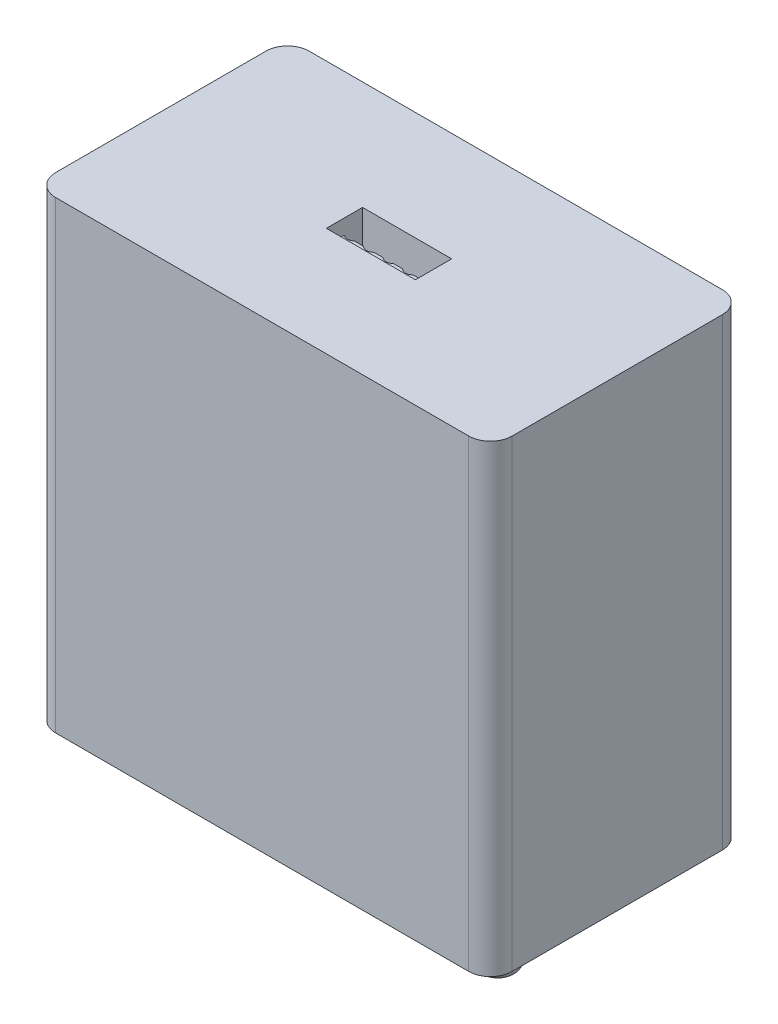
ISO-10303-21;
HEADER;
FILE_DESCRIPTION(('STEP AP214'),'2;1');
FILE_NAME('part.step','',(''),(''),'','','');
FILE_SCHEMA(('AUTOMOTIVE_DESIGN { 1 0 10303 214 1 1 1 1 }'));
ENDSEC;
DATA;
#1=APPLICATION_CONTEXT('core data for automotive mechanical design processes');
#2=APPLICATION_PROTOCOL_DEFINITION('international standard','automotive_design',2000,#1);
#3=PRODUCT_CONTEXT('',#1,'mechanical');
#4=PRODUCT('Part','Part','',(#3));
#5=PRODUCT_RELATED_PRODUCT_CATEGORY('part','',(#4));
#6=PRODUCT_DEFINITION_FORMATION('','',#4);
#7=PRODUCT_DEFINITION_CONTEXT('part definition',#1,'design');
#8=PRODUCT_DEFINITION('design','',#6,#7);
#9=PRODUCT_DEFINITION_SHAPE('','',#8);
#10=(LENGTH_UNIT() NAMED_UNIT(*) SI_UNIT(.MILLI.,.METRE.));
#11=(NAMED_UNIT(*) PLANE_ANGLE_UNIT() SI_UNIT($,.RADIAN.));
#12=(NAMED_UNIT(*) SI_UNIT($,.STERADIAN.) SOLID_ANGLE_UNIT());
#13=UNCERTAINTY_MEASURE_WITH_UNIT(LENGTH_MEASURE(1.E-05),#10,'distance_accuracy_value','');
#14=(GEOMETRIC_REPRESENTATION_CONTEXT(3) GLOBAL_UNCERTAINTY_ASSIGNED_CONTEXT((#13)) GLOBAL_UNIT_ASSIGNED_CONTEXT((#10,
#11,#12)) REPRESENTATION_CONTEXT('',''));
#15=CARTESIAN_POINT('',(0.,0.,0.));
#16=DIRECTION('',(0.,0.,1.));
#17=DIRECTION('',(1.,0.,0.));
#18=AXIS2_PLACEMENT_3D('',#15,#16,#17);
#19=CARTESIAN_POINT('',(0.,51.,0.));
#20=DIRECTION('',(0.,1.,0.));
#21=DIRECTION('',(0.,0.,1.));
#22=AXIS2_PLACEMENT_3D('',#19,#20,#21);
#23=PLANE('',#22);
#24=DIRECTION('',(0.,0.,-1.));
#25=VECTOR('',#24,1.);
#26=CARTESIAN_POINT('',(6.15,51.,-2.5));
#27=LINE('',#26,#25);
#28=CARTESIAN_POINT('',(6.15,51.,2.5));
#29=VERTEX_POINT('',#28);
#30=CARTESIAN_POINT('',(6.15,51.,-2.5));
#31=VERTEX_POINT('',#30);
#32=EDGE_CURVE('E232',#29,#31,#27,.T.);
#33=ORIENTED_EDGE('',*,*,#32,.T.);
#34=DIRECTION('',(-1.,0.,0.));
#35=VECTOR('',#34,1.);
#36=CARTESIAN_POINT('',(-6.15,51.,-2.5));
#37=LINE('',#36,#35);
#38=CARTESIAN_POINT('',(-6.15,51.,-2.5));
#39=VERTEX_POINT('',#38);
#40=EDGE_CURVE('E235',#31,#39,#37,.T.);
#41=ORIENTED_EDGE('',*,*,#40,.T.);
#42=DIRECTION('',(0.,0.,1.));
#43=VECTOR('',#42,1.);
#44=CARTESIAN_POINT('',(-6.15,51.,-2.5));
#45=LINE('',#44,#43);
#46=CARTESIAN_POINT('',(-6.15,51.,2.5));
#47=VERTEX_POINT('',#46);
#48=EDGE_CURVE('E239',#39,#47,#45,.T.);
#49=ORIENTED_EDGE('',*,*,#48,.T.);
#50=DIRECTION('',(1.,0.,0.));
#51=VECTOR('',#50,1.);
#52=CARTESIAN_POINT('',(-6.15,51.,2.5));
#53=LINE('',#52,#51);
#54=EDGE_CURVE('E242',#47,#29,#53,.T.);
#55=ORIENTED_EDGE('',*,*,#54,.T.);
#56=EDGE_LOOP('',(#33,#41,#49,#55));
#57=FACE_BOUND('',#56,.T.);
#58=DIRECTION('',(0.,0.,1.));
#59=VECTOR('',#58,1.);
#60=CARTESIAN_POINT('',(-6.07,51.,0.08));
#61=LINE('',#60,#59);
#62=CARTESIAN_POINT('',(-6.07,51.,0.08));
#63=VERTEX_POINT('',#62);
#64=CARTESIAN_POINT('',(-6.07,51.,2.42));
#65=VERTEX_POINT('',#64);
#66=EDGE_CURVE('E845',#63,#65,#61,.T.);
#67=ORIENTED_EDGE('',*,*,#66,.F.);
#68=CARTESIAN_POINT('',(-4.67835186622215,51.,0.08));
#69=CARTESIAN_POINT('',(-5.39353550879542,51.,0.62478092787932));
#70=CARTESIAN_POINT('',(-6.07,51.,0.08));
#71=B_SPLINE_CURVE_WITH_KNOTS('',2,(#68,#69,#70),.UNSPECIFIED.,.F.,.F.,(3,3),
(0.0848908227443358,0.984687042850501),.UNSPECIFIED.);
#72=CARTESIAN_POINT('',(-4.67835186622215,51.,0.08));
#73=VERTEX_POINT('',#72);
#74=EDGE_CURVE('E223',#73,#63,#71,.T.);
#75=ORIENTED_EDGE('',*,*,#74,.F.);
#76=DIRECTION('',(-1.,0.,0.));
#77=VECTOR('',#76,1.);
#78=CARTESIAN_POINT('',(-4.67835186622215,51.,0.08));
#79=LINE('',#78,#77);
#80=CARTESIAN_POINT('',(-3.45,51.,0.08));
#81=VERTEX_POINT('',#80);
#82=EDGE_CURVE('E219',#81,#73,#79,.T.);
#83=ORIENTED_EDGE('',*,*,#82,.F.);
#84=CARTESIAN_POINT('',(-1.97835186622215,51.,0.08));
#85=CARTESIAN_POINT('',(-2.70454090325813,51.,0.701406982357036));
#86=CARTESIAN_POINT('',(-3.45,51.,0.08));
#87=B_SPLINE_CURVE_WITH_KNOTS('',2,(#84,#85,#86),.UNSPECIFIED.,.F.,.F.,(3,3),
(0.0147087989940526,0.984687042850501),.UNSPECIFIED.);
#88=CARTESIAN_POINT('',(-1.97835186622215,51.,0.08));
#89=VERTEX_POINT('',#88);
#90=EDGE_CURVE('E881',#89,#81,#87,.T.);
#91=ORIENTED_EDGE('',*,*,#90,.F.);
#92=DIRECTION('',(-1.,0.,0.));
#93=VECTOR('',#92,1.);
#94=CARTESIAN_POINT('',(-1.97835186622215,51.,0.08));
#95=LINE('',#94,#93);
#96=CARTESIAN_POINT('',(-0.749999999999999,51.,0.08));
#97=VERTEX_POINT('',#96);
#98=EDGE_CURVE('E876',#97,#89,#95,.T.);
#99=ORIENTED_EDGE('',*,*,#98,.F.);
#100=CARTESIAN_POINT('',(0.721648133777847,51.,0.08));
#101=CARTESIAN_POINT('',(-0.00454090325812818,51.,0.701406982357036));
#102=CARTESIAN_POINT('',(-0.749999999999999,51.,0.08));
#103=B_SPLINE_CURVE_WITH_KNOTS('',2,(#100,#101,#102),.UNSPECIFIED.,.F.,.F.,(3,3),
(0.0147087989940526,0.984687042850501),.UNSPECIFIED.);
#104=CARTESIAN_POINT('',(0.721648133777847,51.,0.08));
#105=VERTEX_POINT('',#104);
#106=EDGE_CURVE('E872',#105,#97,#103,.T.);
#107=ORIENTED_EDGE('',*,*,#106,.F.);
#108=DIRECTION('',(-1.,0.,0.));
#109=VECTOR('',#108,1.);
#110=CARTESIAN_POINT('',(0.721648133777847,51.,0.08));
#111=LINE('',#110,#109);
#112=CARTESIAN_POINT('',(1.95,51.,0.08));
#113=VERTEX_POINT('',#112);
#114=EDGE_CURVE('E867',#113,#105,#111,.T.);
#115=ORIENTED_EDGE('',*,*,#114,.F.);
#116=CARTESIAN_POINT('',(3.42164813377785,51.,0.08));
#117=CARTESIAN_POINT('',(2.69545909674187,51.,0.701406982357037));
#118=CARTESIAN_POINT('',(1.95,51.,0.08));
#119=B_SPLINE_CURVE_WITH_KNOTS('',2,(#116,#117,#118),.UNSPECIFIED.,.F.,.F.,(3,3),
(0.0147087989940526,0.984687042850501),.UNSPECIFIED.);
#120=CARTESIAN_POINT('',(3.42164813377785,51.,0.08));
#121=VERTEX_POINT('',#120);
#122=EDGE_CURVE('E863',#121,#113,#119,.T.);
#123=ORIENTED_EDGE('',*,*,#122,.F.);
#124=DIRECTION('',(-1.,0.,0.));
#125=VECTOR('',#124,1.);
#126=CARTESIAN_POINT('',(3.42164813377785,51.,0.08));
#127=LINE('',#126,#125);
#128=CARTESIAN_POINT('',(4.61899519543171,51.,0.08));
#129=VERTEX_POINT('',#128);
#130=EDGE_CURVE('E858',#129,#121,#127,.T.);
#131=ORIENTED_EDGE('',*,*,#130,.F.);
#132=CARTESIAN_POINT('',(6.07,51.,0.08));
#133=CARTESIAN_POINT('',(5.37598243587965,51.,0.656866539343501));
#134=CARTESIAN_POINT('',(4.61899519543171,51.,0.08));
#135=B_SPLINE_CURVE_WITH_KNOTS('',2,(#132,#133,#134),.UNSPECIFIED.,.F.,.F.,(3,3),
(0.0147087989940526,0.930781283407659),.UNSPECIFIED.);
#136=CARTESIAN_POINT('',(6.07,51.,0.08));
#137=VERTEX_POINT('',#136);
#138=EDGE_CURVE('E854',#137,#129,#135,.T.);
#139=ORIENTED_EDGE('',*,*,#138,.F.);
#140=DIRECTION('',(0.,0.,-1.));
#141=VECTOR('',#140,1.);
#142=CARTESIAN_POINT('',(6.07,51.,0.08));
#143=LINE('',#142,#141);
#144=CARTESIAN_POINT('',(6.07,51.,2.42));
#145=VERTEX_POINT('',#144);
#146=EDGE_CURVE('E852',#145,#137,#143,.T.);
#147=ORIENTED_EDGE('',*,*,#146,.F.);
#148=DIRECTION('',(1.,0.,0.));
#149=VECTOR('',#148,1.);
#150=CARTESIAN_POINT('',(-6.07,51.,2.42));
#151=LINE('',#150,#149);
#152=EDGE_CURVE('E850',#65,#145,#151,.T.);
#153=ORIENTED_EDGE('',*,*,#152,.F.);
#154=EDGE_LOOP('',(#67,#75,#83,#91,#99,#107,#115,#123,#131,#139,#147,#153));
#155=FACE_BOUND('',#154,.T.);
#156=ADVANCED_FACE('F39',(#57,#155),#23,.T.);
#157=CARTESIAN_POINT('',(31.5,64.,17.5));
#158=DIRECTION('',(-1.,0.,0.));
#159=DIRECTION('',(0.,0.,1.));
#160=AXIS2_PLACEMENT_3D('',#157,#158,#159);
#161=PLANE('',#160);
#162=DIRECTION('',(0.,0.,-1.));
#163=VECTOR('',#162,1.);
#164=CARTESIAN_POINT('',(31.5,0.,17.5));
#165=LINE('',#164,#163);
#166=CARTESIAN_POINT('',(31.5,0.,14.5));
#167=VERTEX_POINT('',#166);
#168=CARTESIAN_POINT('',(31.5,0.,-14.5));
#169=VERTEX_POINT('',#168);
#170=EDGE_CURVE('E272',#167,#169,#165,.T.);
#171=ORIENTED_EDGE('',*,*,#170,.T.);
#172=DIRECTION('',(0.,-1.,0.));
#173=VECTOR('',#172,1.);
#174=CARTESIAN_POINT('',(31.5,64.,-14.5));
#175=LINE('',#174,#173);
#176=CARTESIAN_POINT('',(31.5,64.,-14.5));
#177=VERTEX_POINT('',#176);
#178=EDGE_CURVE('E330',#169,#177,#175,.F.);
#179=ORIENTED_EDGE('',*,*,#178,.T.);
#180=DIRECTION('',(0.,0.,-1.));
#181=VECTOR('',#180,1.);
#182=CARTESIAN_POINT('',(31.5,64.,17.5));
#183=LINE('',#182,#181);
#184=CARTESIAN_POINT('',(31.5,64.,14.5));
#185=VERTEX_POINT('',#184);
#186=EDGE_CURVE('E273',#185,#177,#183,.T.);
#187=ORIENTED_EDGE('',*,*,#186,.F.);
#188=DIRECTION('',(0.,-1.,0.));
#189=VECTOR('',#188,1.);
#190=CARTESIAN_POINT('',(31.5,64.,14.5));
#191=LINE('',#190,#189);
#192=EDGE_CURVE('E327',#185,#167,#191,.T.);
#193=ORIENTED_EDGE('',*,*,#192,.T.);
#194=EDGE_LOOP('',(#171,#179,#187,#193));
#195=FACE_BOUND('',#194,.T.);
#196=ADVANCED_FACE('F356',(#195),#161,.F.);
#197=CARTESIAN_POINT('',(-31.5,64.,-17.5));
#198=DIRECTION('',(0.,0.,1.));
#199=DIRECTION('',(1.,0.,0.));
#200=AXIS2_PLACEMENT_3D('',#197,#198,#199);
#201=PLANE('',#200);
#202=DIRECTION('',(-1.,0.,0.));
#203=VECTOR('',#202,1.);
#204=CARTESIAN_POINT('',(-31.5,0.,-17.5));
#205=LINE('',#204,#203);
#206=CARTESIAN_POINT('',(28.5,0.,-17.5));
#207=VERTEX_POINT('',#206);
#208=CARTESIAN_POINT('',(-28.5,0.,-17.5));
#209=VERTEX_POINT('',#208);
#210=EDGE_CURVE('E289',#207,#209,#205,.T.);
#211=ORIENTED_EDGE('',*,*,#210,.T.);
#212=DIRECTION('',(0.,-1.,0.));
#213=VECTOR('',#212,1.);
#214=CARTESIAN_POINT('',(-28.5,64.,-17.5));
#215=LINE('',#214,#213);
#216=CARTESIAN_POINT('',(-28.5,64.,-17.5));
#217=VERTEX_POINT('',#216);
#218=EDGE_CURVE('E325',#209,#217,#215,.F.);
#219=ORIENTED_EDGE('',*,*,#218,.T.);
#220=DIRECTION('',(-1.,0.,0.));
#221=VECTOR('',#220,1.);
#222=CARTESIAN_POINT('',(-31.5,64.,-17.5));
#223=LINE('',#222,#221);
#224=CARTESIAN_POINT('',(28.5,64.,-17.5));
#225=VERTEX_POINT('',#224);
#226=EDGE_CURVE('E276',#225,#217,#223,.T.);
#227=ORIENTED_EDGE('',*,*,#226,.F.);
#228=DIRECTION('',(0.,-1.,0.));
#229=VECTOR('',#228,1.);
#230=CARTESIAN_POINT('',(28.5,64.,-17.5));
#231=LINE('',#230,#229);
#232=EDGE_CURVE('E322',#225,#207,#231,.T.);
#233=ORIENTED_EDGE('',*,*,#232,.T.);
#234=EDGE_LOOP('',(#211,#219,#227,#233));
#235=FACE_BOUND('',#234,.T.);
#236=ADVANCED_FACE('F362',(#235),#201,.F.);
#237=CARTESIAN_POINT('',(-31.5,64.,17.5));
#238=DIRECTION('',(1.,0.,0.));
#239=DIRECTION('',(0.,0.,-1.));
#240=AXIS2_PLACEMENT_3D('',#237,#238,#239);
#241=PLANE('',#240);
#242=DIRECTION('',(0.,0.,1.));
#243=VECTOR('',#242,1.);
#244=CARTESIAN_POINT('',(-31.5,0.,17.5));
#245=LINE('',#244,#243);
#246=CARTESIAN_POINT('',(-31.5,0.,-14.5));
#247=VERTEX_POINT('',#246);
#248=CARTESIAN_POINT('',(-31.5,0.,14.5));
#249=VERTEX_POINT('',#248);
#250=EDGE_CURVE('E292',#247,#249,#245,.T.);
#251=ORIENTED_EDGE('',*,*,#250,.T.);
#252=DIRECTION('',(0.,-1.,0.));
#253=VECTOR('',#252,1.);
#254=CARTESIAN_POINT('',(-31.5,64.,14.5));
#255=LINE('',#254,#253);
#256=CARTESIAN_POINT('',(-31.5,64.,14.5));
#257=VERTEX_POINT('',#256);
#258=EDGE_CURVE('E312',#249,#257,#255,.F.);
#259=ORIENTED_EDGE('',*,*,#258,.T.);
#260=DIRECTION('',(0.,0.,1.));
#261=VECTOR('',#260,1.);
#262=CARTESIAN_POINT('',(-31.5,64.,17.5));
#263=LINE('',#262,#261);
#264=CARTESIAN_POINT('',(-31.5,64.,-14.5));
#265=VERTEX_POINT('',#264);
#266=EDGE_CURVE('E280',#265,#257,#263,.T.);
#267=ORIENTED_EDGE('',*,*,#266,.F.);
#268=DIRECTION('',(0.,-1.,0.));
#269=VECTOR('',#268,1.);
#270=CARTESIAN_POINT('',(-31.5,64.,-14.5));
#271=LINE('',#270,#269);
#272=EDGE_CURVE('E309',#265,#247,#271,.T.);
#273=ORIENTED_EDGE('',*,*,#272,.T.);
#274=EDGE_LOOP('',(#251,#259,#267,#273));
#275=FACE_BOUND('',#274,.T.);
#276=ADVANCED_FACE('F414',(#275),#241,.F.);
#277=CARTESIAN_POINT('',(-31.5,64.,17.5));
#278=DIRECTION('',(0.,0.,-1.));
#279=DIRECTION('',(-1.,0.,0.));
#280=AXIS2_PLACEMENT_3D('',#277,#278,#279);
#281=PLANE('',#280);
#282=DIRECTION('',(1.,0.,0.));
#283=VECTOR('',#282,1.);
#284=CARTESIAN_POINT('',(-31.5,64.,17.5));
#285=LINE('',#284,#283);
#286=CARTESIAN_POINT('',(-28.5,64.,17.5));
#287=VERTEX_POINT('',#286);
#288=CARTESIAN_POINT('',(28.5,64.,17.5));
#289=VERTEX_POINT('',#288);
#290=EDGE_CURVE('E283',#287,#289,#285,.T.);
#291=ORIENTED_EDGE('',*,*,#290,.F.);
#292=DIRECTION('',(0.,-1.,0.));
#293=VECTOR('',#292,1.);
#294=CARTESIAN_POINT('',(-28.5,64.,17.5));
#295=LINE('',#294,#293);
#296=CARTESIAN_POINT('',(-28.5,0.,17.5));
#297=VERTEX_POINT('',#296);
#298=EDGE_CURVE('E298',#287,#297,#295,.T.);
#299=ORIENTED_EDGE('',*,*,#298,.T.);
#300=DIRECTION('',(1.,0.,0.));
#301=VECTOR('',#300,1.);
#302=CARTESIAN_POINT('',(-31.5,0.,17.5));
#303=LINE('',#302,#301);
#304=CARTESIAN_POINT('',(28.5,0.,17.5));
#305=VERTEX_POINT('',#304);
#306=EDGE_CURVE('E277',#297,#305,#303,.T.);
#307=ORIENTED_EDGE('',*,*,#306,.T.);
#308=DIRECTION('',(0.,-1.,0.));
#309=VECTOR('',#308,1.);
#310=CARTESIAN_POINT('',(28.5,64.,17.5));
#311=LINE('',#310,#309);
#312=EDGE_CURVE('E286',#305,#289,#311,.F.);
#313=ORIENTED_EDGE('',*,*,#312,.T.);
#314=EDGE_LOOP('',(#291,#299,#307,#313));
#315=FACE_BOUND('',#314,.T.);
#316=ADVANCED_FACE('F406',(#315),#281,.F.);
#317=CARTESIAN_POINT('',(0.,64.,0.));
#318=DIRECTION('',(0.,-1.,0.));
#319=DIRECTION('',(0.,0.,-1.));
#320=AXIS2_PLACEMENT_3D('',#317,#318,#319);
#321=PLANE('',#320);
#322=DIRECTION('',(-1.,0.,0.));
#323=VECTOR('',#322,1.);
#324=CARTESIAN_POINT('',(-6.15,64.,-2.5));
#325=LINE('',#324,#323);
#326=CARTESIAN_POINT('',(6.15,64.,-2.5));
#327=VERTEX_POINT('',#326);
#328=CARTESIAN_POINT('',(-6.15,64.,-2.5));
#329=VERTEX_POINT('',#328);
#330=EDGE_CURVE('E226',#327,#329,#325,.T.);
#331=ORIENTED_EDGE('',*,*,#330,.F.);
#332=DIRECTION('',(0.,0.,-1.));
#333=VECTOR('',#332,1.);
#334=CARTESIAN_POINT('',(6.15,64.,-2.5));
#335=LINE('',#334,#333);
#336=CARTESIAN_POINT('',(6.15,64.,2.5));
#337=VERTEX_POINT('',#336);
#338=EDGE_CURVE('E62',#337,#327,#335,.T.);
#339=ORIENTED_EDGE('',*,*,#338,.F.);
#340=DIRECTION('',(1.,0.,0.));
#341=VECTOR('',#340,1.);
#342=CARTESIAN_POINT('',(-6.15,64.,2.5));
#343=LINE('',#342,#341);
#344=CARTESIAN_POINT('',(-6.15,64.,2.5));
#345=VERTEX_POINT('',#344);
#346=EDGE_CURVE('E236',#345,#337,#343,.T.);
#347=ORIENTED_EDGE('',*,*,#346,.F.);
#348=DIRECTION('',(0.,0.,1.));
#349=VECTOR('',#348,1.);
#350=CARTESIAN_POINT('',(-6.15,64.,-2.5));
#351=LINE('',#350,#349);
#352=EDGE_CURVE('E248',#329,#345,#351,.T.);
#353=ORIENTED_EDGE('',*,*,#352,.F.);
#354=EDGE_LOOP('',(#331,#339,#347,#353));
#355=FACE_BOUND('',#354,.T.);
#356=ORIENTED_EDGE('',*,*,#266,.T.);
#357=CARTESIAN_POINT('',(-28.5,64.,14.5));
#358=DIRECTION('',(0.,-1.,0.));
#359=DIRECTION('',(0.,0.,-1.));
#360=AXIS2_PLACEMENT_3D('',#357,#358,#359);
#361=CIRCLE('',#360,3.);
#362=EDGE_CURVE('E320',#257,#287,#361,.F.);
#363=ORIENTED_EDGE('',*,*,#362,.T.);
#364=ORIENTED_EDGE('',*,*,#290,.T.);
#365=CARTESIAN_POINT('',(28.5,64.,14.5));
#366=DIRECTION('',(0.,-1.,0.));
#367=DIRECTION('',(0.,0.,-1.));
#368=AXIS2_PLACEMENT_3D('',#365,#366,#367);
#369=CIRCLE('',#368,3.);
#370=EDGE_CURVE('E314',#289,#185,#369,.F.);
#371=ORIENTED_EDGE('',*,*,#370,.T.);
#372=ORIENTED_EDGE('',*,*,#186,.T.);
#373=CARTESIAN_POINT('',(28.5,64.,-14.5));
#374=DIRECTION('',(0.,-1.,0.));
#375=DIRECTION('',(0.,0.,-1.));
#376=AXIS2_PLACEMENT_3D('',#373,#374,#375);
#377=CIRCLE('',#376,3.);
#378=EDGE_CURVE('E316',#177,#225,#377,.F.);
#379=ORIENTED_EDGE('',*,*,#378,.T.);
#380=ORIENTED_EDGE('',*,*,#226,.T.);
#381=CARTESIAN_POINT('',(-28.5,64.,-14.5));
#382=DIRECTION('',(0.,-1.,0.));
#383=DIRECTION('',(0.,0.,-1.));
#384=AXIS2_PLACEMENT_3D('',#381,#382,#383);
#385=CIRCLE('',#384,3.);
#386=EDGE_CURVE('E318',#217,#265,#385,.F.);
#387=ORIENTED_EDGE('',*,*,#386,.T.);
#388=EDGE_LOOP('',(#356,#363,#364,#371,#372,#379,#380,#387));
#389=FACE_BOUND('',#388,.T.);
#390=ADVANCED_FACE('F402',(#355,#389),#321,.F.);
#391=CARTESIAN_POINT('',(0.,0.,0.));
#392=DIRECTION('',(0.,-1.,0.));
#393=DIRECTION('',(0.,0.,-1.));
#394=AXIS2_PLACEMENT_3D('',#391,#392,#393);
#395=PLANE('',#394);
#396=CARTESIAN_POINT('',(0.,0.,0.));
#397=DIRECTION('',(0.,-1.,0.));
#398=DIRECTION('',(0.,0.,-1.));
#399=AXIS2_PLACEMENT_3D('',#396,#397,#398);
#400=CIRCLE('',#399,0.5);
#401=CARTESIAN_POINT('',(0.,0.,-0.5));
#402=VERTEX_POINT('',#401);
#403=EDGE_CURVE('E255',#402,#402,#400,.T.);
#404=ORIENTED_EDGE('',*,*,#403,.F.);
#405=EDGE_LOOP('',(#404));
#406=FACE_BOUND('',#405,.T.);
#407=CARTESIAN_POINT('',(15.,0.,0.));
#408=DIRECTION('',(0.,-1.,0.));
#409=DIRECTION('',(0.,0.,1.));
#410=AXIS2_PLACEMENT_3D('',#407,#408,#409);
#411=CIRCLE('',#410,2.5);
#412=CARTESIAN_POINT('',(15.,0.,2.5));
#413=VERTEX_POINT('',#412);
#414=EDGE_CURVE('E264',#413,#413,#411,.T.);
#415=ORIENTED_EDGE('',*,*,#414,.F.);
#416=EDGE_LOOP('',(#415));
#417=FACE_BOUND('',#416,.T.);
#418=CARTESIAN_POINT('',(-15.,0.,0.));
#419=DIRECTION('',(0.,-1.,0.));
#420=DIRECTION('',(0.,0.,-1.));
#421=AXIS2_PLACEMENT_3D('',#418,#419,#420);
#422=CIRCLE('',#421,2.5);
#423=CARTESIAN_POINT('',(-15.,0.,-2.5));
#424=VERTEX_POINT('',#423);
#425=EDGE_CURVE('E269',#424,#424,#422,.T.);
#426=ORIENTED_EDGE('',*,*,#425,.F.);
#427=EDGE_LOOP('',(#426));
#428=FACE_BOUND('',#427,.T.);
#429=ORIENTED_EDGE('',*,*,#306,.F.);
#430=CARTESIAN_POINT('',(-28.5,0.,14.5));
#431=DIRECTION('',(0.,-1.,0.));
#432=DIRECTION('',(0.,0.,-1.));
#433=AXIS2_PLACEMENT_3D('',#430,#431,#432);
#434=CIRCLE('',#433,3.);
#435=EDGE_CURVE('E307',#297,#249,#434,.T.);
#436=ORIENTED_EDGE('',*,*,#435,.T.);
#437=ORIENTED_EDGE('',*,*,#250,.F.);
#438=CARTESIAN_POINT('',(-28.5,0.,-14.5));
#439=DIRECTION('',(0.,-1.,0.));
#440=DIRECTION('',(0.,0.,-1.));
#441=AXIS2_PLACEMENT_3D('',#438,#439,#440);
#442=CIRCLE('',#441,3.);
#443=EDGE_CURVE('E305',#247,#209,#442,.T.);
#444=ORIENTED_EDGE('',*,*,#443,.T.);
#445=ORIENTED_EDGE('',*,*,#210,.F.);
#446=CARTESIAN_POINT('',(28.5,0.,-14.5));
#447=DIRECTION('',(0.,-1.,0.));
#448=DIRECTION('',(0.,0.,-1.));
#449=AXIS2_PLACEMENT_3D('',#446,#447,#448);
#450=CIRCLE('',#449,3.);
#451=EDGE_CURVE('E303',#207,#169,#450,.T.);
#452=ORIENTED_EDGE('',*,*,#451,.T.);
#453=ORIENTED_EDGE('',*,*,#170,.F.);
#454=CARTESIAN_POINT('',(28.5,0.,14.5));
#455=DIRECTION('',(0.,-1.,0.));
#456=DIRECTION('',(0.,0.,-1.));
#457=AXIS2_PLACEMENT_3D('',#454,#455,#456);
#458=CIRCLE('',#457,3.);
#459=EDGE_CURVE('E301',#167,#305,#458,.T.);
#460=ORIENTED_EDGE('',*,*,#459,.T.);
#461=EDGE_LOOP('',(#429,#436,#437,#444,#445,#452,#453,#460));
#462=FACE_BOUND('',#461,.T.);
#463=ADVANCED_FACE('F405',(#406,#417,#428,#462),#395,.T.);
#464=CARTESIAN_POINT('',(-28.5,64.,14.5));
#465=DIRECTION('',(0.,-1.,0.));
#466=DIRECTION('',(0.,0.,-1.));
#467=AXIS2_PLACEMENT_3D('',#464,#465,#466);
#468=CYLINDRICAL_SURFACE('',#467,3.);
#469=ORIENTED_EDGE('',*,*,#362,.F.);
#470=ORIENTED_EDGE('',*,*,#258,.F.);
#471=ORIENTED_EDGE('',*,*,#435,.F.);
#472=ORIENTED_EDGE('',*,*,#298,.F.);
#473=EDGE_LOOP('',(#469,#470,#471,#472));
#474=FACE_BOUND('',#473,.T.);
#475=ADVANCED_FACE('F410',(#474),#468,.T.);
#476=CARTESIAN_POINT('',(-28.5,64.,-14.5));
#477=DIRECTION('',(0.,-1.,0.));
#478=DIRECTION('',(0.,0.,-1.));
#479=AXIS2_PLACEMENT_3D('',#476,#477,#478);
#480=CYLINDRICAL_SURFACE('',#479,3.);
#481=ORIENTED_EDGE('',*,*,#386,.F.);
#482=ORIENTED_EDGE('',*,*,#218,.F.);
#483=ORIENTED_EDGE('',*,*,#443,.F.);
#484=ORIENTED_EDGE('',*,*,#272,.F.);
#485=EDGE_LOOP('',(#481,#482,#483,#484));
#486=FACE_BOUND('',#485,.T.);
#487=ADVANCED_FACE('F424',(#486),#480,.T.);
#488=CARTESIAN_POINT('',(28.5,64.,-14.5));
#489=DIRECTION('',(0.,-1.,0.));
#490=DIRECTION('',(0.,0.,-1.));
#491=AXIS2_PLACEMENT_3D('',#488,#489,#490);
#492=CYLINDRICAL_SURFACE('',#491,3.);
#493=ORIENTED_EDGE('',*,*,#378,.F.);
#494=ORIENTED_EDGE('',*,*,#178,.F.);
#495=ORIENTED_EDGE('',*,*,#451,.F.);
#496=ORIENTED_EDGE('',*,*,#232,.F.);
#497=EDGE_LOOP('',(#493,#494,#495,#496));
#498=FACE_BOUND('',#497,.T.);
#499=ADVANCED_FACE('F428',(#498),#492,.T.);
#500=CARTESIAN_POINT('',(28.5,64.,14.5));
#501=DIRECTION('',(0.,-1.,0.));
#502=DIRECTION('',(0.,0.,-1.));
#503=AXIS2_PLACEMENT_3D('',#500,#501,#502);
#504=CYLINDRICAL_SURFACE('',#503,3.);
#505=ORIENTED_EDGE('',*,*,#370,.F.);
#506=ORIENTED_EDGE('',*,*,#312,.F.);
#507=ORIENTED_EDGE('',*,*,#459,.F.);
#508=ORIENTED_EDGE('',*,*,#192,.F.);
#509=EDGE_LOOP('',(#505,#506,#507,#508));
#510=FACE_BOUND('',#509,.T.);
#511=ADVANCED_FACE('F400',(#510),#504,.T.);
#512=CARTESIAN_POINT('',(-15.,-15.,0.));
#513=DIRECTION('',(0.,1.,0.));
#514=DIRECTION('',(0.,0.,1.));
#515=AXIS2_PLACEMENT_3D('',#512,#513,#514);
#516=CYLINDRICAL_SURFACE('',#515,2.5);
#517=CARTESIAN_POINT('',(-15.,-14.,0.));
#518=DIRECTION('',(0.,-1.,0.));
#519=DIRECTION('',(0.,0.,-1.));
#520=AXIS2_PLACEMENT_3D('',#517,#518,#519);
#521=CIRCLE('',#520,2.5);
#522=CARTESIAN_POINT('',(-15.,-14.,-2.5));
#523=VERTEX_POINT('',#522);
#524=EDGE_CURVE('E335',#523,#523,#521,.F.);
#525=ORIENTED_EDGE('',*,*,#524,.T.);
#526=EDGE_LOOP('',(#525));
#527=FACE_BOUND('',#526,.T.);
#528=ORIENTED_EDGE('',*,*,#425,.T.);
#529=EDGE_LOOP('',(#528));
#530=FACE_BOUND('',#529,.T.);
#531=ADVANCED_FACE('F396',(#527,#530),#516,.T.);
#532=CARTESIAN_POINT('',(-15.,-15.,0.));
#533=DIRECTION('',(0.,-1.,0.));
#534=DIRECTION('',(0.,0.,-1.));
#535=AXIS2_PLACEMENT_3D('',#532,#533,#534);
#536=PLANE('',#535);
#537=CARTESIAN_POINT('',(-15.,-15.,0.));
#538=DIRECTION('',(0.,-1.,0.));
#539=DIRECTION('',(0.,0.,-1.));
#540=AXIS2_PLACEMENT_3D('',#537,#538,#539);
#541=CIRCLE('',#540,1.5);
#542=CARTESIAN_POINT('',(-15.,-15.,-1.5));
#543=VERTEX_POINT('',#542);
#544=EDGE_CURVE('E332',#543,#543,#541,.T.);
#545=ORIENTED_EDGE('',*,*,#544,.T.);
#546=EDGE_LOOP('',(#545));
#547=FACE_BOUND('',#546,.T.);
#548=ADVANCED_FACE('F390',(#547),#536,.T.);
#549=CARTESIAN_POINT('',(15.,-15.,0.));
#550=DIRECTION('',(0.,1.,0.));
#551=DIRECTION('',(0.,0.,1.));
#552=AXIS2_PLACEMENT_3D('',#549,#550,#551);
#553=CYLINDRICAL_SURFACE('',#552,2.5);
#554=CARTESIAN_POINT('',(15.,-14.,0.));
#555=DIRECTION('',(0.,1.,0.));
#556=DIRECTION('',(0.,0.,1.));
#557=AXIS2_PLACEMENT_3D('',#554,#555,#556);
#558=CIRCLE('',#557,2.5);
#559=CARTESIAN_POINT('',(15.,-14.,2.5));
#560=VERTEX_POINT('',#559);
#561=EDGE_CURVE('E11',#560,#560,#558,.T.);
#562=ORIENTED_EDGE('',*,*,#561,.T.);
#563=EDGE_LOOP('',(#562));
#564=FACE_BOUND('',#563,.T.);
#565=ORIENTED_EDGE('',*,*,#414,.T.);
#566=EDGE_LOOP('',(#565));
#567=FACE_BOUND('',#566,.T.);
#568=ADVANCED_FACE('F387',(#564,#567),#553,.T.);
#569=CARTESIAN_POINT('',(15.,-15.,0.));
#570=DIRECTION('',(0.,1.,0.));
#571=DIRECTION('',(0.,0.,1.));
#572=AXIS2_PLACEMENT_3D('',#569,#570,#571);
#573=PLANE('',#572);
#574=CARTESIAN_POINT('',(15.,-15.,0.));
#575=DIRECTION('',(0.,1.,0.));
#576=DIRECTION('',(0.,0.,1.));
#577=AXIS2_PLACEMENT_3D('',#574,#575,#576);
#578=CIRCLE('',#577,1.5);
#579=CARTESIAN_POINT('',(15.,-15.,1.5));
#580=VERTEX_POINT('',#579);
#581=EDGE_CURVE('E47',#580,#580,#578,.F.);
#582=ORIENTED_EDGE('',*,*,#581,.T.);
#583=EDGE_LOOP('',(#582));
#584=FACE_BOUND('',#583,.T.);
#585=ADVANCED_FACE('F340',(#584),#573,.F.);
#586=CARTESIAN_POINT('',(-15.,-14.,0.));
#587=DIRECTION('',(0.,-1.,0.));
#588=DIRECTION('',(0.,0.,-1.));
#589=AXIS2_PLACEMENT_3D('',#586,#587,#588);
#590=TOROIDAL_SURFACE('',#589,1.5,1.);
#591=ORIENTED_EDGE('',*,*,#524,.F.);
#592=EDGE_LOOP('',(#591));
#593=FACE_BOUND('',#592,.T.);
#594=ORIENTED_EDGE('',*,*,#544,.F.);
#595=EDGE_LOOP('',(#594));
#596=FACE_BOUND('',#595,.T.);
#597=ADVANCED_FACE('F344',(#593,#596),#590,.T.);
#598=CARTESIAN_POINT('',(15.,-14.,0.));
#599=DIRECTION('',(0.,1.,0.));
#600=DIRECTION('',(0.,0.,1.));
#601=AXIS2_PLACEMENT_3D('',#598,#599,#600);
#602=TOROIDAL_SURFACE('',#601,1.5,1.);
#603=ORIENTED_EDGE('',*,*,#561,.F.);
#604=EDGE_LOOP('',(#603));
#605=FACE_BOUND('',#604,.T.);
#606=ORIENTED_EDGE('',*,*,#581,.F.);
#607=EDGE_LOOP('',(#606));
#608=FACE_BOUND('',#607,.T.);
#609=ADVANCED_FACE('F41',(#605,#608),#602,.T.);
#610=CARTESIAN_POINT('',(0.,1.,0.));
#611=DIRECTION('',(0.,-1.,0.));
#612=DIRECTION('',(0.,0.,-1.));
#613=AXIS2_PLACEMENT_3D('',#610,#611,#612);
#614=CYLINDRICAL_SURFACE('',#613,0.5);
#615=CARTESIAN_POINT('',(0.,1.,0.));
#616=DIRECTION('',(0.,-1.,0.));
#617=DIRECTION('',(0.,0.,-1.));
#618=AXIS2_PLACEMENT_3D('',#615,#616,#617);
#619=CIRCLE('',#618,0.5);
#620=CARTESIAN_POINT('',(0.,1.,-0.5));
#621=VERTEX_POINT('',#620);
#622=EDGE_CURVE('E261',#621,#621,#619,.T.);
#623=ORIENTED_EDGE('',*,*,#622,.F.);
#624=EDGE_LOOP('',(#623));
#625=FACE_BOUND('',#624,.T.);
#626=ORIENTED_EDGE('',*,*,#403,.T.);
#627=EDGE_LOOP('',(#626));
#628=FACE_BOUND('',#627,.T.);
#629=ADVANCED_FACE('F343',(#625,#628),#614,.F.);
#630=CARTESIAN_POINT('',(0.,1.,0.));
#631=DIRECTION('',(0.,-1.,0.));
#632=DIRECTION('',(0.,0.,-1.));
#633=AXIS2_PLACEMENT_3D('',#630,#631,#632);
#634=PLANE('',#633);
#635=ORIENTED_EDGE('',*,*,#622,.T.);
#636=EDGE_LOOP('',(#635));
#637=FACE_BOUND('',#636,.T.);
#638=ADVANCED_FACE('F350',(#637),#634,.T.);
#639=CARTESIAN_POINT('',(6.15,51.,-2.5));
#640=DIRECTION('',(1.,0.,0.));
#641=DIRECTION('',(0.,0.,-1.));
#642=AXIS2_PLACEMENT_3D('',#639,#640,#641);
#643=PLANE('',#642);
#644=ORIENTED_EDGE('',*,*,#338,.T.);
#645=DIRECTION('',(0.,1.,0.));
#646=VECTOR('',#645,1.);
#647=CARTESIAN_POINT('',(6.15,51.,-2.5));
#648=LINE('',#647,#646);
#649=EDGE_CURVE('E244',#31,#327,#648,.T.);
#650=ORIENTED_EDGE('',*,*,#649,.F.);
#651=ORIENTED_EDGE('',*,*,#32,.F.);
#652=DIRECTION('',(0.,1.,0.));
#653=VECTOR('',#652,1.);
#654=CARTESIAN_POINT('',(6.15,51.,2.5));
#655=LINE('',#654,#653);
#656=EDGE_CURVE('E253',#29,#337,#655,.T.);
#657=ORIENTED_EDGE('',*,*,#656,.T.);
#658=EDGE_LOOP('',(#644,#650,#651,#657));
#659=FACE_BOUND('',#658,.T.);
#660=ADVANCED_FACE('F373',(#659),#643,.F.);
#661=CARTESIAN_POINT('',(-6.15,51.,2.5));
#662=DIRECTION('',(0.,0.,1.));
#663=DIRECTION('',(1.,0.,0.));
#664=AXIS2_PLACEMENT_3D('',#661,#662,#663);
#665=PLANE('',#664);
#666=ORIENTED_EDGE('',*,*,#346,.T.);
#667=ORIENTED_EDGE('',*,*,#656,.F.);
#668=ORIENTED_EDGE('',*,*,#54,.F.);
#669=DIRECTION('',(0.,1.,0.));
#670=VECTOR('',#669,1.);
#671=CARTESIAN_POINT('',(-6.15,51.,2.5));
#672=LINE('',#671,#670);
#673=EDGE_CURVE('E256',#47,#345,#672,.T.);
#674=ORIENTED_EDGE('',*,*,#673,.T.);
#675=EDGE_LOOP('',(#666,#667,#668,#674));
#676=FACE_BOUND('',#675,.T.);
#677=ADVANCED_FACE('F369',(#676),#665,.F.);
#678=CARTESIAN_POINT('',(-6.15,51.,-2.5));
#679=DIRECTION('',(-1.,0.,0.));
#680=DIRECTION('',(0.,0.,1.));
#681=AXIS2_PLACEMENT_3D('',#678,#679,#680);
#682=PLANE('',#681);
#683=ORIENTED_EDGE('',*,*,#352,.T.);
#684=ORIENTED_EDGE('',*,*,#673,.F.);
#685=ORIENTED_EDGE('',*,*,#48,.F.);
#686=DIRECTION('',(0.,1.,0.));
#687=VECTOR('',#686,1.);
#688=CARTESIAN_POINT('',(-6.15,51.,-2.5));
#689=LINE('',#688,#687);
#690=EDGE_CURVE('E258',#39,#329,#689,.T.);
#691=ORIENTED_EDGE('',*,*,#690,.T.);
#692=EDGE_LOOP('',(#683,#684,#685,#691));
#693=FACE_BOUND('',#692,.T.);
#694=ADVANCED_FACE('F372',(#693),#682,.F.);
#695=CARTESIAN_POINT('',(-6.15,51.,-2.5));
#696=DIRECTION('',(0.,0.,-1.));
#697=DIRECTION('',(-1.,0.,0.));
#698=AXIS2_PLACEMENT_3D('',#695,#696,#697);
#699=PLANE('',#698);
#700=ORIENTED_EDGE('',*,*,#330,.T.);
#701=ORIENTED_EDGE('',*,*,#690,.F.);
#702=ORIENTED_EDGE('',*,*,#40,.F.);
#703=ORIENTED_EDGE('',*,*,#649,.T.);
#704=EDGE_LOOP('',(#700,#701,#702,#703));
#705=FACE_BOUND('',#704,.T.);
#706=ADVANCED_FACE('F377',(#705),#699,.F.);
#707=CARTESIAN_POINT('',(-4.67835186622215,62.,0.08));
#708=CARTESIAN_POINT('',(-5.39353550879542,62.,0.62478092787932));
#709=CARTESIAN_POINT('',(-6.07,62.,0.08));
#710=B_SPLINE_CURVE_WITH_KNOTS('',2,(#707,#708,#709),.UNSPECIFIED.,.F.,.F.,(3,3),
(0.0848908227443358,0.984687042850501),.UNSPECIFIED.);
#711=DIRECTION('',(0.,-1.,0.));
#712=VECTOR('',#711,1.);
#713=SURFACE_OF_LINEAR_EXTRUSION('',#710,#712);
#714=ORIENTED_EDGE('',*,*,#74,.T.);
#715=DIRECTION('',(0.,-1.,0.));
#716=VECTOR('',#715,1.);
#717=CARTESIAN_POINT('',(-6.07,62.,0.08));
#718=LINE('',#717,#716);
#719=CARTESIAN_POINT('',(-6.07,62.,0.08));
#720=VERTEX_POINT('',#719);
#721=EDGE_CURVE('E204',#720,#63,#718,.T.);
#722=ORIENTED_EDGE('',*,*,#721,.F.);
#723=CARTESIAN_POINT('',(-4.67835186622215,62.,0.08));
#724=VERTEX_POINT('',#723);
#725=EDGE_CURVE('E211',#724,#720,#710,.T.);
#726=ORIENTED_EDGE('',*,*,#725,.F.);
#727=DIRECTION('',(0.,-1.,0.));
#728=VECTOR('',#727,1.);
#729=CARTESIAN_POINT('',(-4.67835186622215,62.,0.08));
#730=LINE('',#729,#728);
#731=EDGE_CURVE('E841',#724,#73,#730,.T.);
#732=ORIENTED_EDGE('',*,*,#731,.T.);
#733=EDGE_LOOP('',(#714,#722,#726,#732));
#734=FACE_BOUND('',#733,.T.);
#735=ADVANCED_FACE('F221',(#734),#713,.F.);
#736=CARTESIAN_POINT('',(-6.07,62.,0.08));
#737=DIRECTION('',(1.,0.,0.));
#738=DIRECTION('',(0.,0.,-1.));
#739=AXIS2_PLACEMENT_3D('',#736,#737,#738);
#740=PLANE('',#739);
#741=ORIENTED_EDGE('',*,*,#66,.T.);
#742=DIRECTION('',(0.,-1.,0.));
#743=VECTOR('',#742,1.);
#744=CARTESIAN_POINT('',(-6.07,62.,2.42));
#745=LINE('',#744,#743);
#746=CARTESIAN_POINT('',(-6.07,62.,2.42));
#747=VERTEX_POINT('',#746);
#748=EDGE_CURVE('E207',#747,#65,#745,.T.);
#749=ORIENTED_EDGE('',*,*,#748,.F.);
#750=DIRECTION('',(0.,0.,1.));
#751=VECTOR('',#750,1.);
#752=CARTESIAN_POINT('',(-6.07,62.,0.08));
#753=LINE('',#752,#751);
#754=EDGE_CURVE('E200',#720,#747,#753,.T.);
#755=ORIENTED_EDGE('',*,*,#754,.F.);
#756=ORIENTED_EDGE('',*,*,#721,.T.);
#757=EDGE_LOOP('',(#741,#749,#755,#756));
#758=FACE_BOUND('',#757,.T.);
#759=ADVANCED_FACE('F202',(#758),#740,.F.);
#760=CARTESIAN_POINT('',(-6.07,62.,2.42));
#761=DIRECTION('',(0.,0.,-1.));
#762=DIRECTION('',(-1.,0.,0.));
#763=AXIS2_PLACEMENT_3D('',#760,#761,#762);
#764=PLANE('',#763);
#765=ORIENTED_EDGE('',*,*,#152,.T.);
#766=DIRECTION('',(0.,-1.,0.));
#767=VECTOR('',#766,1.);
#768=CARTESIAN_POINT('',(6.07,62.,2.42));
#769=LINE('',#768,#767);
#770=CARTESIAN_POINT('',(6.07,62.,2.42));
#771=VERTEX_POINT('',#770);
#772=EDGE_CURVE('E228',#771,#145,#769,.T.);
#773=ORIENTED_EDGE('',*,*,#772,.F.);
#774=DIRECTION('',(1.,0.,0.));
#775=VECTOR('',#774,1.);
#776=CARTESIAN_POINT('',(-6.07,62.,2.42));
#777=LINE('',#776,#775);
#778=EDGE_CURVE('E210',#747,#771,#777,.T.);
#779=ORIENTED_EDGE('',*,*,#778,.F.);
#780=ORIENTED_EDGE('',*,*,#748,.T.);
#781=EDGE_LOOP('',(#765,#773,#779,#780));
#782=FACE_BOUND('',#781,.T.);
#783=ADVANCED_FACE('F563',(#782),#764,.F.);
#784=CARTESIAN_POINT('',(6.07,62.,0.08));
#785=DIRECTION('',(-1.,0.,0.));
#786=DIRECTION('',(0.,0.,1.));
#787=AXIS2_PLACEMENT_3D('',#784,#785,#786);
#788=PLANE('',#787);
#789=ORIENTED_EDGE('',*,*,#146,.T.);
#790=DIRECTION('',(0.,-1.,0.));
#791=VECTOR('',#790,1.);
#792=CARTESIAN_POINT('',(6.07,62.,0.08));
#793=LINE('',#792,#791);
#794=CARTESIAN_POINT('',(6.07,62.,0.08));
#795=VERTEX_POINT('',#794);
#796=EDGE_CURVE('E909',#795,#137,#793,.T.);
#797=ORIENTED_EDGE('',*,*,#796,.F.);
#798=DIRECTION('',(0.,0.,-1.));
#799=VECTOR('',#798,1.);
#800=CARTESIAN_POINT('',(6.07,62.,0.08));
#801=LINE('',#800,#799);
#802=EDGE_CURVE('E806',#771,#795,#801,.T.);
#803=ORIENTED_EDGE('',*,*,#802,.F.);
#804=ORIENTED_EDGE('',*,*,#772,.T.);
#805=EDGE_LOOP('',(#789,#797,#803,#804));
#806=FACE_BOUND('',#805,.T.);
#807=ADVANCED_FACE('F555',(#806),#788,.F.);
#808=CARTESIAN_POINT('',(6.07,62.,0.08));
#809=CARTESIAN_POINT('',(5.37598243587965,62.,0.656866539343501));
#810=CARTESIAN_POINT('',(4.61899519543171,62.,0.08));
#811=B_SPLINE_CURVE_WITH_KNOTS('',2,(#808,#809,#810),.UNSPECIFIED.,.F.,.F.,(3,3),
(0.0147087989940526,0.930781283407659),.UNSPECIFIED.);
#812=DIRECTION('',(0.,-1.,0.));
#813=VECTOR('',#812,1.);
#814=SURFACE_OF_LINEAR_EXTRUSION('',#811,#813);
#815=ORIENTED_EDGE('',*,*,#138,.T.);
#816=DIRECTION('',(0.,-1.,0.));
#817=VECTOR('',#816,1.);
#818=CARTESIAN_POINT('',(4.61899519543171,62.,0.08));
#819=LINE('',#818,#817);
#820=CARTESIAN_POINT('',(4.61899519543171,62.,0.08));
#821=VERTEX_POINT('',#820);
#822=EDGE_CURVE('E906',#821,#129,#819,.T.);
#823=ORIENTED_EDGE('',*,*,#822,.F.);
#824=EDGE_CURVE('E799',#795,#821,#811,.T.);
#825=ORIENTED_EDGE('',*,*,#824,.F.);
#826=ORIENTED_EDGE('',*,*,#796,.T.);
#827=EDGE_LOOP('',(#815,#823,#825,#826));
#828=FACE_BOUND('',#827,.T.);
#829=ADVANCED_FACE('F547',(#828),#814,.F.);
#830=CARTESIAN_POINT('',(3.42164813377785,62.,0.08));
#831=DIRECTION('',(0.,0.,1.));
#832=DIRECTION('',(1.,0.,0.));
#833=AXIS2_PLACEMENT_3D('',#830,#831,#832);
#834=PLANE('',#833);
#835=ORIENTED_EDGE('',*,*,#130,.T.);
#836=DIRECTION('',(0.,-1.,0.));
#837=VECTOR('',#836,1.);
#838=CARTESIAN_POINT('',(3.42164813377785,62.,0.08));
#839=LINE('',#838,#837);
#840=CARTESIAN_POINT('',(3.42164813377785,62.,0.08));
#841=VERTEX_POINT('',#840);
#842=EDGE_CURVE('E903',#841,#121,#839,.T.);
#843=ORIENTED_EDGE('',*,*,#842,.F.);
#844=DIRECTION('',(-1.,0.,0.));
#845=VECTOR('',#844,1.);
#846=CARTESIAN_POINT('',(3.42164813377785,62.,0.08));
#847=LINE('',#846,#845);
#848=EDGE_CURVE('E805',#821,#841,#847,.T.);
#849=ORIENTED_EDGE('',*,*,#848,.F.);
#850=ORIENTED_EDGE('',*,*,#822,.T.);
#851=EDGE_LOOP('',(#835,#843,#849,#850));
#852=FACE_BOUND('',#851,.T.);
#853=ADVANCED_FACE('F539',(#852),#834,.F.);
#854=CARTESIAN_POINT('',(3.42164813377785,62.,0.08));
#855=CARTESIAN_POINT('',(2.69545909674187,62.,0.701406982357037));
#856=CARTESIAN_POINT('',(1.95,62.,0.08));
#857=B_SPLINE_CURVE_WITH_KNOTS('',2,(#854,#855,#856),.UNSPECIFIED.,.F.,.F.,(3,3),
(0.0147087989940526,0.984687042850501),.UNSPECIFIED.);
#858=DIRECTION('',(0.,-1.,0.));
#859=VECTOR('',#858,1.);
#860=SURFACE_OF_LINEAR_EXTRUSION('',#857,#859);
#861=ORIENTED_EDGE('',*,*,#122,.T.);
#862=DIRECTION('',(0.,-1.,0.));
#863=VECTOR('',#862,1.);
#864=CARTESIAN_POINT('',(1.95,62.,0.08));
#865=LINE('',#864,#863);
#866=CARTESIAN_POINT('',(1.95,62.,0.08));
#867=VERTEX_POINT('',#866);
#868=EDGE_CURVE('E900',#867,#113,#865,.T.);
#869=ORIENTED_EDGE('',*,*,#868,.F.);
#870=EDGE_CURVE('E812',#841,#867,#857,.T.);
#871=ORIENTED_EDGE('',*,*,#870,.F.);
#872=ORIENTED_EDGE('',*,*,#842,.T.);
#873=EDGE_LOOP('',(#861,#869,#871,#872));
#874=FACE_BOUND('',#873,.T.);
#875=ADVANCED_FACE('F531',(#874),#860,.F.);
#876=CARTESIAN_POINT('',(0.721648133777847,62.,0.08));
#877=DIRECTION('',(0.,0.,1.));
#878=DIRECTION('',(1.,0.,0.));
#879=AXIS2_PLACEMENT_3D('',#876,#877,#878);
#880=PLANE('',#879);
#881=ORIENTED_EDGE('',*,*,#114,.T.);
#882=DIRECTION('',(0.,-1.,0.));
#883=VECTOR('',#882,1.);
#884=CARTESIAN_POINT('',(0.721648133777847,62.,0.08));
#885=LINE('',#884,#883);
#886=CARTESIAN_POINT('',(0.721648133777847,62.,0.08));
#887=VERTEX_POINT('',#886);
#888=EDGE_CURVE('E897',#887,#105,#885,.T.);
#889=ORIENTED_EDGE('',*,*,#888,.F.);
#890=DIRECTION('',(-1.,0.,0.));
#891=VECTOR('',#890,1.);
#892=CARTESIAN_POINT('',(0.721648133777847,62.,0.08));
#893=LINE('',#892,#891);
#894=EDGE_CURVE('E817',#867,#887,#893,.T.);
#895=ORIENTED_EDGE('',*,*,#894,.F.);
#896=ORIENTED_EDGE('',*,*,#868,.T.);
#897=EDGE_LOOP('',(#881,#889,#895,#896));
#898=FACE_BOUND('',#897,.T.);
#899=ADVANCED_FACE('F523',(#898),#880,.F.);
#900=CARTESIAN_POINT('',(0.721648133777847,62.,0.08));
#901=CARTESIAN_POINT('',(-0.00454090325812818,62.,0.701406982357036));
#902=CARTESIAN_POINT('',(-0.749999999999999,62.,0.08));
#903=B_SPLINE_CURVE_WITH_KNOTS('',2,(#900,#901,#902),.UNSPECIFIED.,.F.,.F.,(3,3),
(0.0147087989940526,0.984687042850501),.UNSPECIFIED.);
#904=DIRECTION('',(0.,-1.,0.));
#905=VECTOR('',#904,1.);
#906=SURFACE_OF_LINEAR_EXTRUSION('',#903,#905);
#907=ORIENTED_EDGE('',*,*,#106,.T.);
#908=DIRECTION('',(0.,-1.,0.));
#909=VECTOR('',#908,1.);
#910=CARTESIAN_POINT('',(-0.749999999999999,62.,0.08));
#911=LINE('',#910,#909);
#912=CARTESIAN_POINT('',(-0.749999999999999,62.,0.08));
#913=VERTEX_POINT('',#912);
#914=EDGE_CURVE('E894',#913,#97,#911,.T.);
#915=ORIENTED_EDGE('',*,*,#914,.F.);
#916=EDGE_CURVE('E822',#887,#913,#903,.T.);
#917=ORIENTED_EDGE('',*,*,#916,.F.);
#918=ORIENTED_EDGE('',*,*,#888,.T.);
#919=EDGE_LOOP('',(#907,#915,#917,#918));
#920=FACE_BOUND('',#919,.T.);
#921=ADVANCED_FACE('F515',(#920),#906,.F.);
#922=CARTESIAN_POINT('',(-1.97835186622215,62.,0.08));
#923=DIRECTION('',(0.,0.,1.));
#924=DIRECTION('',(1.,0.,0.));
#925=AXIS2_PLACEMENT_3D('',#922,#923,#924);
#926=PLANE('',#925);
#927=ORIENTED_EDGE('',*,*,#98,.T.);
#928=DIRECTION('',(0.,-1.,0.));
#929=VECTOR('',#928,1.);
#930=CARTESIAN_POINT('',(-1.97835186622215,62.,0.08));
#931=LINE('',#930,#929);
#932=CARTESIAN_POINT('',(-1.97835186622215,62.,0.08));
#933=VERTEX_POINT('',#932);
#934=EDGE_CURVE('E891',#933,#89,#931,.T.);
#935=ORIENTED_EDGE('',*,*,#934,.F.);
#936=DIRECTION('',(-1.,0.,0.));
#937=VECTOR('',#936,1.);
#938=CARTESIAN_POINT('',(-1.97835186622215,62.,0.08));
#939=LINE('',#938,#937);
#940=EDGE_CURVE('E827',#913,#933,#939,.T.);
#941=ORIENTED_EDGE('',*,*,#940,.F.);
#942=ORIENTED_EDGE('',*,*,#914,.T.);
#943=EDGE_LOOP('',(#927,#935,#941,#942));
#944=FACE_BOUND('',#943,.T.);
#945=ADVANCED_FACE('F507',(#944),#926,.F.);
#946=CARTESIAN_POINT('',(-1.97835186622215,62.,0.08));
#947=CARTESIAN_POINT('',(-2.70454090325813,62.,0.701406982357036));
#948=CARTESIAN_POINT('',(-3.45,62.,0.08));
#949=B_SPLINE_CURVE_WITH_KNOTS('',2,(#946,#947,#948),.UNSPECIFIED.,.F.,.F.,(3,3),
(0.0147087989940526,0.984687042850501),.UNSPECIFIED.);
#950=DIRECTION('',(0.,-1.,0.));
#951=VECTOR('',#950,1.);
#952=SURFACE_OF_LINEAR_EXTRUSION('',#949,#951);
#953=ORIENTED_EDGE('',*,*,#90,.T.);
#954=DIRECTION('',(0.,-1.,0.));
#955=VECTOR('',#954,1.);
#956=CARTESIAN_POINT('',(-3.45,62.,0.08));
#957=LINE('',#956,#955);
#958=CARTESIAN_POINT('',(-3.45,62.,0.08));
#959=VERTEX_POINT('',#958);
#960=EDGE_CURVE('E54',#959,#81,#957,.T.);
#961=ORIENTED_EDGE('',*,*,#960,.F.);
#962=EDGE_CURVE('E832',#933,#959,#949,.T.);
#963=ORIENTED_EDGE('',*,*,#962,.F.);
#964=ORIENTED_EDGE('',*,*,#934,.T.);
#965=EDGE_LOOP('',(#953,#961,#963,#964));
#966=FACE_BOUND('',#965,.T.);
#967=ADVANCED_FACE('F500',(#966),#952,.F.);
#968=CARTESIAN_POINT('',(-4.67835186622215,62.,0.08));
#969=DIRECTION('',(0.,0.,1.));
#970=DIRECTION('',(1.,0.,0.));
#971=AXIS2_PLACEMENT_3D('',#968,#969,#970);
#972=PLANE('',#971);
#973=ORIENTED_EDGE('',*,*,#82,.T.);
#974=ORIENTED_EDGE('',*,*,#731,.F.);
#975=DIRECTION('',(-1.,0.,0.));
#976=VECTOR('',#975,1.);
#977=CARTESIAN_POINT('',(-4.67835186622215,62.,0.08));
#978=LINE('',#977,#976);
#979=EDGE_CURVE('E215',#959,#724,#978,.T.);
#980=ORIENTED_EDGE('',*,*,#979,.F.);
#981=ORIENTED_EDGE('',*,*,#960,.T.);
#982=EDGE_LOOP('',(#973,#974,#980,#981));
#983=FACE_BOUND('',#982,.T.);
#984=ADVANCED_FACE('F491',(#983),#972,.F.);
#985=CARTESIAN_POINT('',(-5.38385572095325,62.,0.35239046393966));
#986=DIRECTION('',(0.,1.,0.));
#987=DIRECTION('',(0.,0.,1.));
#988=AXIS2_PLACEMENT_3D('',#985,#986,#987);
#989=PLANE('',#988);
#990=ORIENTED_EDGE('',*,*,#725,.T.);
#991=ORIENTED_EDGE('',*,*,#754,.T.);
#992=ORIENTED_EDGE('',*,*,#778,.T.);
#993=ORIENTED_EDGE('',*,*,#802,.T.);
#994=ORIENTED_EDGE('',*,*,#824,.T.);
#995=ORIENTED_EDGE('',*,*,#848,.T.);
#996=ORIENTED_EDGE('',*,*,#870,.T.);
#997=ORIENTED_EDGE('',*,*,#894,.T.);
#998=ORIENTED_EDGE('',*,*,#916,.T.);
#999=ORIENTED_EDGE('',*,*,#940,.T.);
#1000=ORIENTED_EDGE('',*,*,#962,.T.);
#1001=ORIENTED_EDGE('',*,*,#979,.T.);
#1002=EDGE_LOOP('',(#990,#991,#992,#993,#994,#995,#996,#997,#998,#999,#1000,#1001));
#1003=FACE_BOUND('',#1002,.T.);
#1004=ADVANCED_FACE('F214',(#1003),#989,.T.);
#1005=CLOSED_SHELL('',(#156,#196,#236,#276,#316,#390,#463,#475,#487,#499,#511,#531,#548,#568,
#585,#597,#609,#629,#638,#660,#677,#694,#706,#735,#759,#783,#807,#829,#853,#875,#899,#921,#945,
#967,#984,#1004));
#1006=MANIFOLD_SOLID_BREP('B2',#1005);
#1007=ADVANCED_BREP_SHAPE_REPRESENTATION('',(#18,#1006),#14);
#1008=SHAPE_DEFINITION_REPRESENTATION(#9,#1007);
ENDSEC;
END-ISO-10303-21;
